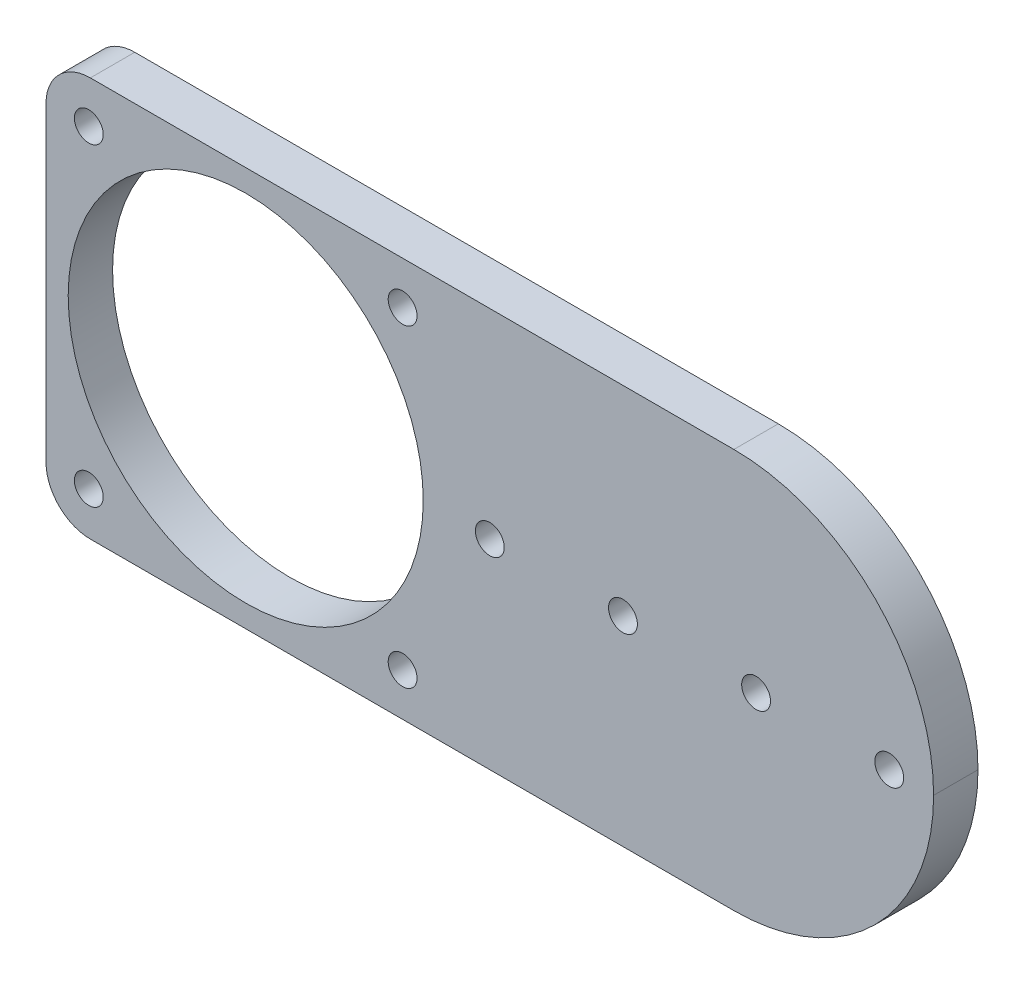
ISO-10303-21;
HEADER;
FILE_DESCRIPTION(('STEP AP214'),'2;1');
FILE_NAME('part.step','',(''),(''),'','','');
FILE_SCHEMA(('AUTOMOTIVE_DESIGN { 1 0 10303 214 1 1 1 1 }'));
ENDSEC;
DATA;
#1=APPLICATION_CONTEXT('core data for automotive mechanical design processes');
#2=APPLICATION_PROTOCOL_DEFINITION('international standard','automotive_design',2000,#1);
#3=PRODUCT_CONTEXT('',#1,'mechanical');
#4=PRODUCT('Part','Part','',(#3));
#5=PRODUCT_RELATED_PRODUCT_CATEGORY('part','',(#4));
#6=PRODUCT_DEFINITION_FORMATION('','',#4);
#7=PRODUCT_DEFINITION_CONTEXT('part definition',#1,'design');
#8=PRODUCT_DEFINITION('design','',#6,#7);
#9=PRODUCT_DEFINITION_SHAPE('','',#8);
#10=(LENGTH_UNIT() NAMED_UNIT(*) SI_UNIT(.MILLI.,.METRE.));
#11=(NAMED_UNIT(*) PLANE_ANGLE_UNIT() SI_UNIT($,.RADIAN.));
#12=(NAMED_UNIT(*) SI_UNIT($,.STERADIAN.) SOLID_ANGLE_UNIT());
#13=UNCERTAINTY_MEASURE_WITH_UNIT(LENGTH_MEASURE(1.E-05),#10,'distance_accuracy_value','');
#14=(GEOMETRIC_REPRESENTATION_CONTEXT(3) GLOBAL_UNCERTAINTY_ASSIGNED_CONTEXT((#13)) GLOBAL_UNIT_ASSIGNED_CONTEXT((#10,
#11,#12)) REPRESENTATION_CONTEXT('',''));
#15=CARTESIAN_POINT('',(0.,0.,0.));
#16=DIRECTION('',(0.,0.,1.));
#17=DIRECTION('',(1.,0.,0.));
#18=AXIS2_PLACEMENT_3D('',#15,#16,#17);
#19=CARTESIAN_POINT('',(0.,0.,10.));
#20=DIRECTION('',(0.,0.,1.));
#21=DIRECTION('',(1.,0.,0.));
#22=AXIS2_PLACEMENT_3D('',#19,#20,#21);
#23=PLANE('',#22);
#24=CARTESIAN_POINT('',(100.245231607629,0.,10.));
#25=DIRECTION('',(0.,0.,1.));
#26=DIRECTION('',(1.,0.,0.));
#27=AXIS2_PLACEMENT_3D('',#24,#25,#26);
#28=CIRCLE('',#27,3.25000000000001);
#29=CARTESIAN_POINT('',(103.495231607629,0.,10.));
#30=VERTEX_POINT('',#29);
#31=EDGE_CURVE('E487',#30,#30,#28,.T.);
#32=ORIENTED_EDGE('',*,*,#31,.F.);
#33=EDGE_LOOP('',(#32));
#34=FACE_BOUND('',#33,.T.);
#35=CARTESIAN_POINT('',(-50.1101074516982,-35.3553390593269,10.));
#36=DIRECTION('',(0.,0.,1.));
#37=DIRECTION('',(1.,0.,0.));
#38=AXIS2_PLACEMENT_3D('',#35,#36,#37);
#39=CIRCLE('',#38,3.24999999999999);
#40=CARTESIAN_POINT('',(-46.8601074516982,-35.3553390593269,10.));
#41=VERTEX_POINT('',#40);
#42=EDGE_CURVE('E468',#41,#41,#39,.T.);
#43=ORIENTED_EDGE('',*,*,#42,.F.);
#44=EDGE_LOOP('',(#43));
#45=FACE_BOUND('',#44,.T.);
#46=CARTESIAN_POINT('',(20.6005706669572,-35.3553390593269,10.));
#47=DIRECTION('',(0.,0.,1.));
#48=DIRECTION('',(1.,0.,0.));
#49=AXIS2_PLACEMENT_3D('',#46,#47,#48);
#50=CIRCLE('',#49,3.25);
#51=CARTESIAN_POINT('',(23.8505706669572,-35.3553390593269,10.));
#52=VERTEX_POINT('',#51);
#53=EDGE_CURVE('E235',#52,#52,#50,.T.);
#54=ORIENTED_EDGE('',*,*,#53,.F.);
#55=EDGE_LOOP('',(#54));
#56=FACE_BOUND('',#55,.T.);
#57=CARTESIAN_POINT('',(-14.7547683923706,0.,10.));
#58=DIRECTION('',(0.,0.,1.));
#59=DIRECTION('',(1.,0.,0.));
#60=AXIS2_PLACEMENT_3D('',#57,#58,#59);
#61=CIRCLE('',#60,40.);
#62=CARTESIAN_POINT('',(25.2452316076294,0.,10.));
#63=VERTEX_POINT('',#62);
#64=EDGE_CURVE('E216',#63,#63,#61,.T.);
#65=ORIENTED_EDGE('',*,*,#64,.F.);
#66=EDGE_LOOP('',(#65));
#67=FACE_BOUND('',#66,.T.);
#68=DIRECTION('',(0.,-1.,0.));
#69=VECTOR('',#68,1.);
#70=CARTESIAN_POINT('',(-59.7547683923706,45.,10.));
#71=LINE('',#70,#69);
#72=CARTESIAN_POINT('',(-59.7547683923706,35.,10.));
#73=VERTEX_POINT('',#72);
#74=CARTESIAN_POINT('',(-59.7547683923706,-35.,10.));
#75=VERTEX_POINT('',#74);
#76=EDGE_CURVE('E160',#73,#75,#71,.T.);
#77=ORIENTED_EDGE('',*,*,#76,.T.);
#78=CARTESIAN_POINT('',(-49.7547683923706,-35.,10.));
#79=DIRECTION('',(0.,0.,1.));
#80=DIRECTION('',(1.,0.,0.));
#81=AXIS2_PLACEMENT_3D('',#78,#79,#80);
#82=CIRCLE('',#81,10.);
#83=CARTESIAN_POINT('',(-49.7547683923706,-45.,10.));
#84=VERTEX_POINT('',#83);
#85=EDGE_CURVE('E54',#75,#84,#82,.T.);
#86=ORIENTED_EDGE('',*,*,#85,.T.);
#87=DIRECTION('',(1.,0.,0.));
#88=VECTOR('',#87,1.);
#89=CARTESIAN_POINT('',(-59.7547683923706,-45.,10.));
#90=LINE('',#89,#88);
#91=CARTESIAN_POINT('',(95.2452316076294,-45.,10.));
#92=VERTEX_POINT('',#91);
#93=EDGE_CURVE('E120',#84,#92,#90,.T.);
#94=ORIENTED_EDGE('',*,*,#93,.T.);
#95=CARTESIAN_POINT('',(95.2452316076294,0.,10.));
#96=DIRECTION('',(0.,0.,1.));
#97=DIRECTION('',(1.,0.,0.));
#98=AXIS2_PLACEMENT_3D('',#95,#96,#97);
#99=CIRCLE('',#98,45.);
#100=CARTESIAN_POINT('',(140.245231607629,0.,10.));
#101=VERTEX_POINT('',#100);
#102=EDGE_CURVE('E144',#92,#101,#99,.T.);
#103=ORIENTED_EDGE('',*,*,#102,.T.);
#104=CARTESIAN_POINT('',(95.2452316076294,0.,10.));
#105=DIRECTION('',(0.,0.,1.));
#106=DIRECTION('',(1.,0.,0.));
#107=AXIS2_PLACEMENT_3D('',#104,#105,#106);
#108=CIRCLE('',#107,45.);
#109=CARTESIAN_POINT('',(95.2452316076294,45.,10.));
#110=VERTEX_POINT('',#109);
#111=EDGE_CURVE('E126',#101,#110,#108,.T.);
#112=ORIENTED_EDGE('',*,*,#111,.T.);
#113=DIRECTION('',(-1.,0.,0.));
#114=VECTOR('',#113,1.);
#115=CARTESIAN_POINT('',(-59.7547683923706,45.,10.));
#116=LINE('',#115,#114);
#117=CARTESIAN_POINT('',(-49.7547683923706,45.,10.));
#118=VERTEX_POINT('',#117);
#119=EDGE_CURVE('E155',#110,#118,#116,.T.);
#120=ORIENTED_EDGE('',*,*,#119,.T.);
#121=CARTESIAN_POINT('',(-49.7547683923706,35.,10.));
#122=DIRECTION('',(0.,0.,1.));
#123=DIRECTION('',(1.,0.,0.));
#124=AXIS2_PLACEMENT_3D('',#121,#122,#123);
#125=CIRCLE('',#124,10.);
#126=EDGE_CURVE('E176',#118,#73,#125,.T.);
#127=ORIENTED_EDGE('',*,*,#126,.T.);
#128=EDGE_LOOP('',(#77,#86,#94,#103,#112,#120,#127));
#129=FACE_BOUND('',#128,.T.);
#130=CARTESIAN_POINT('',(-50.1101074516982,35.3553390593272,10.));
#131=DIRECTION('',(0.,0.,1.));
#132=DIRECTION('',(1.,0.,0.));
#133=AXIS2_PLACEMENT_3D('',#130,#131,#132);
#134=CIRCLE('',#133,3.25);
#135=CARTESIAN_POINT('',(-46.8601074516981,35.3553390593272,10.));
#136=VERTEX_POINT('',#135);
#137=EDGE_CURVE('E209',#136,#136,#134,.T.);
#138=ORIENTED_EDGE('',*,*,#137,.F.);
#139=EDGE_LOOP('',(#138));
#140=FACE_BOUND('',#139,.T.);
#141=CARTESIAN_POINT('',(20.6005706669572,35.3553390593272,10.));
#142=DIRECTION('',(0.,0.,1.));
#143=DIRECTION('',(1.,0.,0.));
#144=AXIS2_PLACEMENT_3D('',#141,#142,#143);
#145=CIRCLE('',#144,3.25);
#146=CARTESIAN_POINT('',(23.8505706669572,35.3553390593272,10.));
#147=VERTEX_POINT('',#146);
#148=EDGE_CURVE('E224',#147,#147,#145,.T.);
#149=ORIENTED_EDGE('',*,*,#148,.F.);
#150=EDGE_LOOP('',(#149));
#151=FACE_BOUND('',#150,.T.);
#152=CARTESIAN_POINT('',(40.2452316076294,0.,10.));
#153=DIRECTION('',(0.,0.,1.));
#154=DIRECTION('',(1.,0.,0.));
#155=AXIS2_PLACEMENT_3D('',#152,#153,#154);
#156=CIRCLE('',#155,3.25);
#157=CARTESIAN_POINT('',(43.4952316076294,0.,10.));
#158=VERTEX_POINT('',#157);
#159=EDGE_CURVE('E460',#158,#158,#156,.T.);
#160=ORIENTED_EDGE('',*,*,#159,.F.);
#161=EDGE_LOOP('',(#160));
#162=FACE_BOUND('',#161,.T.);
#163=CARTESIAN_POINT('',(70.2452316076294,0.,10.));
#164=DIRECTION('',(0.,0.,1.));
#165=DIRECTION('',(1.,0.,0.));
#166=AXIS2_PLACEMENT_3D('',#163,#164,#165);
#167=CIRCLE('',#166,3.25000000000001);
#168=CARTESIAN_POINT('',(73.4952316076294,0.,10.));
#169=VERTEX_POINT('',#168);
#170=EDGE_CURVE('E486',#169,#169,#167,.T.);
#171=ORIENTED_EDGE('',*,*,#170,.F.);
#172=EDGE_LOOP('',(#171));
#173=FACE_BOUND('',#172,.T.);
#174=CARTESIAN_POINT('',(130.245231607629,0.,10.));
#175=DIRECTION('',(0.,0.,1.));
#176=DIRECTION('',(1.,0.,0.));
#177=AXIS2_PLACEMENT_3D('',#174,#175,#176);
#178=CIRCLE('',#177,3.25000000000001);
#179=CARTESIAN_POINT('',(133.495231607629,0.,10.));
#180=VERTEX_POINT('',#179);
#181=EDGE_CURVE('E495',#180,#180,#178,.T.);
#182=ORIENTED_EDGE('',*,*,#181,.F.);
#183=EDGE_LOOP('',(#182));
#184=FACE_BOUND('',#183,.T.);
#185=ADVANCED_FACE('F45',(#34,#45,#56,#67,#129,#140,#151,#162,#173,#184),#23,.T.);
#186=CARTESIAN_POINT('',(0.,0.,0.));
#187=DIRECTION('',(0.,0.,1.));
#188=DIRECTION('',(1.,0.,0.));
#189=AXIS2_PLACEMENT_3D('',#186,#187,#188);
#190=PLANE('',#189);
#191=DIRECTION('',(1.,0.,0.));
#192=VECTOR('',#191,1.);
#193=CARTESIAN_POINT('',(-59.7547683923706,-45.,0.));
#194=LINE('',#193,#192);
#195=CARTESIAN_POINT('',(-49.7547683923706,-45.,0.));
#196=VERTEX_POINT('',#195);
#197=CARTESIAN_POINT('',(95.2452316076294,-45.,0.));
#198=VERTEX_POINT('',#197);
#199=EDGE_CURVE('E161',#196,#198,#194,.T.);
#200=ORIENTED_EDGE('',*,*,#199,.F.);
#201=CARTESIAN_POINT('',(-49.7547683923706,-35.,0.));
#202=DIRECTION('',(0.,0.,1.));
#203=DIRECTION('',(1.,0.,0.));
#204=AXIS2_PLACEMENT_3D('',#201,#202,#203);
#205=CIRCLE('',#204,10.);
#206=CARTESIAN_POINT('',(-59.7547683923706,-35.,0.));
#207=VERTEX_POINT('',#206);
#208=EDGE_CURVE('E186',#196,#207,#205,.F.);
#209=ORIENTED_EDGE('',*,*,#208,.T.);
#210=DIRECTION('',(0.,-1.,0.));
#211=VECTOR('',#210,1.);
#212=CARTESIAN_POINT('',(-59.7547683923706,45.,0.));
#213=LINE('',#212,#211);
#214=CARTESIAN_POINT('',(-59.7547683923706,35.,0.));
#215=VERTEX_POINT('',#214);
#216=EDGE_CURVE('E205',#215,#207,#213,.T.);
#217=ORIENTED_EDGE('',*,*,#216,.F.);
#218=CARTESIAN_POINT('',(-49.7547683923706,35.,0.));
#219=DIRECTION('',(0.,0.,1.));
#220=DIRECTION('',(1.,0.,0.));
#221=AXIS2_PLACEMENT_3D('',#218,#219,#220);
#222=CIRCLE('',#221,10.);
#223=CARTESIAN_POINT('',(-49.7547683923706,45.,0.));
#224=VERTEX_POINT('',#223);
#225=EDGE_CURVE('E189',#215,#224,#222,.F.);
#226=ORIENTED_EDGE('',*,*,#225,.T.);
#227=DIRECTION('',(-1.,0.,0.));
#228=VECTOR('',#227,1.);
#229=CARTESIAN_POINT('',(-59.7547683923706,45.,0.));
#230=LINE('',#229,#228);
#231=CARTESIAN_POINT('',(95.2452316076294,45.,0.));
#232=VERTEX_POINT('',#231);
#233=EDGE_CURVE('E116',#232,#224,#230,.T.);
#234=ORIENTED_EDGE('',*,*,#233,.F.);
#235=CARTESIAN_POINT('',(95.2452316076294,0.,0.));
#236=DIRECTION('',(0.,0.,1.));
#237=DIRECTION('',(1.,0.,0.));
#238=AXIS2_PLACEMENT_3D('',#235,#236,#237);
#239=CIRCLE('',#238,45.);
#240=CARTESIAN_POINT('',(140.245231607629,0.,0.));
#241=VERTEX_POINT('',#240);
#242=EDGE_CURVE('E108',#232,#241,#239,.F.);
#243=ORIENTED_EDGE('',*,*,#242,.T.);
#244=CARTESIAN_POINT('',(95.2452316076294,0.,0.));
#245=DIRECTION('',(0.,0.,1.));
#246=DIRECTION('',(1.,0.,0.));
#247=AXIS2_PLACEMENT_3D('',#244,#245,#246);
#248=CIRCLE('',#247,45.);
#249=EDGE_CURVE('E114',#241,#198,#248,.F.);
#250=ORIENTED_EDGE('',*,*,#249,.T.);
#251=EDGE_LOOP('',(#200,#209,#217,#226,#234,#243,#250));
#252=FACE_BOUND('',#251,.T.);
#253=CARTESIAN_POINT('',(-50.1101074516982,35.3553390593272,0.));
#254=DIRECTION('',(0.,0.,1.));
#255=DIRECTION('',(1.,0.,0.));
#256=AXIS2_PLACEMENT_3D('',#253,#254,#255);
#257=CIRCLE('',#256,3.25);
#258=CARTESIAN_POINT('',(-46.8601074516981,35.3553390593272,0.));
#259=VERTEX_POINT('',#258);
#260=EDGE_CURVE('E162',#259,#259,#257,.T.);
#261=ORIENTED_EDGE('',*,*,#260,.T.);
#262=EDGE_LOOP('',(#261));
#263=FACE_BOUND('',#262,.T.);
#264=CARTESIAN_POINT('',(-14.7547683923706,0.,0.));
#265=DIRECTION('',(0.,0.,1.));
#266=DIRECTION('',(1.,0.,0.));
#267=AXIS2_PLACEMENT_3D('',#264,#265,#266);
#268=CIRCLE('',#267,40.);
#269=CARTESIAN_POINT('',(25.2452316076294,0.,0.));
#270=VERTEX_POINT('',#269);
#271=EDGE_CURVE('E219',#270,#270,#268,.T.);
#272=ORIENTED_EDGE('',*,*,#271,.T.);
#273=EDGE_LOOP('',(#272));
#274=FACE_BOUND('',#273,.T.);
#275=CARTESIAN_POINT('',(20.6005706669572,35.3553390593272,0.));
#276=DIRECTION('',(0.,0.,1.));
#277=DIRECTION('',(1.,0.,0.));
#278=AXIS2_PLACEMENT_3D('',#275,#276,#277);
#279=CIRCLE('',#278,3.25);
#280=CARTESIAN_POINT('',(23.8505706669572,35.3553390593272,0.));
#281=VERTEX_POINT('',#280);
#282=EDGE_CURVE('E230',#281,#281,#279,.T.);
#283=ORIENTED_EDGE('',*,*,#282,.T.);
#284=EDGE_LOOP('',(#283));
#285=FACE_BOUND('',#284,.T.);
#286=CARTESIAN_POINT('',(20.6005706669572,-35.3553390593269,0.));
#287=DIRECTION('',(0.,0.,1.));
#288=DIRECTION('',(1.,0.,0.));
#289=AXIS2_PLACEMENT_3D('',#286,#287,#288);
#290=CIRCLE('',#289,3.25);
#291=CARTESIAN_POINT('',(23.8505706669572,-35.3553390593269,0.));
#292=VERTEX_POINT('',#291);
#293=EDGE_CURVE('E231',#292,#292,#290,.T.);
#294=ORIENTED_EDGE('',*,*,#293,.T.);
#295=EDGE_LOOP('',(#294));
#296=FACE_BOUND('',#295,.T.);
#297=CARTESIAN_POINT('',(40.2452316076294,0.,0.));
#298=DIRECTION('',(0.,0.,1.));
#299=DIRECTION('',(1.,0.,0.));
#300=AXIS2_PLACEMENT_3D('',#297,#298,#299);
#301=CIRCLE('',#300,3.25);
#302=CARTESIAN_POINT('',(43.4952316076294,0.,0.));
#303=VERTEX_POINT('',#302);
#304=EDGE_CURVE('E464',#303,#303,#301,.T.);
#305=ORIENTED_EDGE('',*,*,#304,.T.);
#306=EDGE_LOOP('',(#305));
#307=FACE_BOUND('',#306,.T.);
#308=CARTESIAN_POINT('',(-50.1101074516982,-35.3553390593269,0.));
#309=DIRECTION('',(0.,0.,1.));
#310=DIRECTION('',(1.,0.,0.));
#311=AXIS2_PLACEMENT_3D('',#308,#309,#310);
#312=CIRCLE('',#311,3.24999999999999);
#313=CARTESIAN_POINT('',(-46.8601074516982,-35.3553390593269,0.));
#314=VERTEX_POINT('',#313);
#315=EDGE_CURVE('E472',#314,#314,#312,.T.);
#316=ORIENTED_EDGE('',*,*,#315,.T.);
#317=EDGE_LOOP('',(#316));
#318=FACE_BOUND('',#317,.T.);
#319=CARTESIAN_POINT('',(70.2452316076294,0.,0.));
#320=DIRECTION('',(0.,0.,1.));
#321=DIRECTION('',(1.,0.,0.));
#322=AXIS2_PLACEMENT_3D('',#319,#320,#321);
#323=CIRCLE('',#322,3.25000000000001);
#324=CARTESIAN_POINT('',(73.4952316076294,0.,0.));
#325=VERTEX_POINT('',#324);
#326=EDGE_CURVE('E482',#325,#325,#323,.T.);
#327=ORIENTED_EDGE('',*,*,#326,.T.);
#328=EDGE_LOOP('',(#327));
#329=FACE_BOUND('',#328,.T.);
#330=CARTESIAN_POINT('',(100.245231607629,0.,0.));
#331=DIRECTION('',(0.,0.,1.));
#332=DIRECTION('',(1.,0.,0.));
#333=AXIS2_PLACEMENT_3D('',#330,#331,#332);
#334=CIRCLE('',#333,3.25000000000001);
#335=CARTESIAN_POINT('',(103.495231607629,0.,0.));
#336=VERTEX_POINT('',#335);
#337=EDGE_CURVE('E492',#336,#336,#334,.T.);
#338=ORIENTED_EDGE('',*,*,#337,.T.);
#339=EDGE_LOOP('',(#338));
#340=FACE_BOUND('',#339,.T.);
#341=CARTESIAN_POINT('',(130.245231607629,0.,0.));
#342=DIRECTION('',(0.,0.,1.));
#343=DIRECTION('',(1.,0.,0.));
#344=AXIS2_PLACEMENT_3D('',#341,#342,#343);
#345=CIRCLE('',#344,3.25000000000001);
#346=CARTESIAN_POINT('',(133.495231607629,0.,0.));
#347=VERTEX_POINT('',#346);
#348=EDGE_CURVE('E130',#347,#347,#345,.T.);
#349=ORIENTED_EDGE('',*,*,#348,.T.);
#350=EDGE_LOOP('',(#349));
#351=FACE_BOUND('',#350,.T.);
#352=ADVANCED_FACE('F111',(#252,#263,#274,#285,#296,#307,#318,#329,#340,#351),#190,.F.);
#353=CARTESIAN_POINT('',(-59.7547683923706,45.,10.));
#354=DIRECTION('',(0.,-1.,0.));
#355=DIRECTION('',(0.,0.,-1.));
#356=AXIS2_PLACEMENT_3D('',#353,#354,#355);
#357=PLANE('',#356);
#358=ORIENTED_EDGE('',*,*,#233,.T.);
#359=DIRECTION('',(0.,0.,-1.));
#360=VECTOR('',#359,1.);
#361=CARTESIAN_POINT('',(-49.7547683923706,45.,10.));
#362=LINE('',#361,#360);
#363=EDGE_CURVE('E12',#224,#118,#362,.F.);
#364=ORIENTED_EDGE('',*,*,#363,.T.);
#365=ORIENTED_EDGE('',*,*,#119,.F.);
#366=DIRECTION('',(0.,0.,-1.));
#367=VECTOR('',#366,1.);
#368=CARTESIAN_POINT('',(95.2452316076294,45.,10.));
#369=LINE('',#368,#367);
#370=EDGE_CURVE('E195',#110,#232,#369,.T.);
#371=ORIENTED_EDGE('',*,*,#370,.T.);
#372=EDGE_LOOP('',(#358,#364,#365,#371));
#373=FACE_BOUND('',#372,.T.);
#374=ADVANCED_FACE('F266',(#373),#357,.F.);
#375=CARTESIAN_POINT('',(-59.7547683923706,45.,10.));
#376=DIRECTION('',(1.,0.,0.));
#377=DIRECTION('',(0.,0.,-1.));
#378=AXIS2_PLACEMENT_3D('',#375,#376,#377);
#379=PLANE('',#378);
#380=ORIENTED_EDGE('',*,*,#216,.T.);
#381=DIRECTION('',(0.,0.,-1.));
#382=VECTOR('',#381,1.);
#383=CARTESIAN_POINT('',(-59.7547683923706,-35.,10.));
#384=LINE('',#383,#382);
#385=EDGE_CURVE('E67',#207,#75,#384,.F.);
#386=ORIENTED_EDGE('',*,*,#385,.T.);
#387=ORIENTED_EDGE('',*,*,#76,.F.);
#388=DIRECTION('',(0.,0.,-1.));
#389=VECTOR('',#388,1.);
#390=CARTESIAN_POINT('',(-59.7547683923706,35.,10.));
#391=LINE('',#390,#389);
#392=EDGE_CURVE('E182',#73,#215,#391,.T.);
#393=ORIENTED_EDGE('',*,*,#392,.T.);
#394=EDGE_LOOP('',(#380,#386,#387,#393));
#395=FACE_BOUND('',#394,.T.);
#396=ADVANCED_FACE('F273',(#395),#379,.F.);
#397=CARTESIAN_POINT('',(-59.7547683923706,-45.,10.));
#398=DIRECTION('',(0.,1.,0.));
#399=DIRECTION('',(0.,0.,1.));
#400=AXIS2_PLACEMENT_3D('',#397,#398,#399);
#401=PLANE('',#400);
#402=ORIENTED_EDGE('',*,*,#93,.F.);
#403=DIRECTION('',(0.,0.,-1.));
#404=VECTOR('',#403,1.);
#405=CARTESIAN_POINT('',(-49.7547683923706,-45.,10.));
#406=LINE('',#405,#404);
#407=EDGE_CURVE('E192',#84,#196,#406,.T.);
#408=ORIENTED_EDGE('',*,*,#407,.T.);
#409=ORIENTED_EDGE('',*,*,#199,.T.);
#410=DIRECTION('',(0.,0.,-1.));
#411=VECTOR('',#410,1.);
#412=CARTESIAN_POINT('',(95.2452316076294,-45.,10.));
#413=LINE('',#412,#411);
#414=EDGE_CURVE('E134',#198,#92,#413,.F.);
#415=ORIENTED_EDGE('',*,*,#414,.T.);
#416=EDGE_LOOP('',(#402,#408,#409,#415));
#417=FACE_BOUND('',#416,.T.);
#418=ADVANCED_FACE('F202',(#417),#401,.F.);
#419=CARTESIAN_POINT('',(-50.1101074516982,35.3553390593272,10.));
#420=DIRECTION('',(0.,0.,-1.));
#421=DIRECTION('',(-1.,0.,0.));
#422=AXIS2_PLACEMENT_3D('',#419,#420,#421);
#423=CYLINDRICAL_SURFACE('',#422,3.25);
#424=ORIENTED_EDGE('',*,*,#137,.T.);
#425=EDGE_LOOP('',(#424));
#426=FACE_BOUND('',#425,.T.);
#427=ORIENTED_EDGE('',*,*,#260,.F.);
#428=EDGE_LOOP('',(#427));
#429=FACE_BOUND('',#428,.T.);
#430=ADVANCED_FACE('F250',(#426,#429),#423,.F.);
#431=CARTESIAN_POINT('',(-14.7547683923706,0.,10.));
#432=DIRECTION('',(0.,0.,-1.));
#433=DIRECTION('',(-1.,0.,0.));
#434=AXIS2_PLACEMENT_3D('',#431,#432,#433);
#435=CYLINDRICAL_SURFACE('',#434,40.);
#436=ORIENTED_EDGE('',*,*,#64,.T.);
#437=EDGE_LOOP('',(#436));
#438=FACE_BOUND('',#437,.T.);
#439=ORIENTED_EDGE('',*,*,#271,.F.);
#440=EDGE_LOOP('',(#439));
#441=FACE_BOUND('',#440,.T.);
#442=ADVANCED_FACE('F247',(#438,#441),#435,.F.);
#443=CARTESIAN_POINT('',(20.6005706669572,35.3553390593272,10.));
#444=DIRECTION('',(0.,0.,-1.));
#445=DIRECTION('',(-1.,0.,0.));
#446=AXIS2_PLACEMENT_3D('',#443,#444,#445);
#447=CYLINDRICAL_SURFACE('',#446,3.25);
#448=ORIENTED_EDGE('',*,*,#148,.T.);
#449=EDGE_LOOP('',(#448));
#450=FACE_BOUND('',#449,.T.);
#451=ORIENTED_EDGE('',*,*,#282,.F.);
#452=EDGE_LOOP('',(#451));
#453=FACE_BOUND('',#452,.T.);
#454=ADVANCED_FACE('F249',(#450,#453),#447,.F.);
#455=CARTESIAN_POINT('',(20.6005706669572,-35.3553390593269,10.));
#456=DIRECTION('',(0.,0.,-1.));
#457=DIRECTION('',(-1.,0.,0.));
#458=AXIS2_PLACEMENT_3D('',#455,#456,#457);
#459=CYLINDRICAL_SURFACE('',#458,3.25);
#460=ORIENTED_EDGE('',*,*,#53,.T.);
#461=EDGE_LOOP('',(#460));
#462=FACE_BOUND('',#461,.T.);
#463=ORIENTED_EDGE('',*,*,#293,.F.);
#464=EDGE_LOOP('',(#463));
#465=FACE_BOUND('',#464,.T.);
#466=ADVANCED_FACE('F256',(#462,#465),#459,.F.);
#467=CARTESIAN_POINT('',(40.2452316076294,0.,10.));
#468=DIRECTION('',(0.,0.,-1.));
#469=DIRECTION('',(-1.,0.,0.));
#470=AXIS2_PLACEMENT_3D('',#467,#468,#469);
#471=CYLINDRICAL_SURFACE('',#470,3.25);
#472=ORIENTED_EDGE('',*,*,#159,.T.);
#473=EDGE_LOOP('',(#472));
#474=FACE_BOUND('',#473,.T.);
#475=ORIENTED_EDGE('',*,*,#304,.F.);
#476=EDGE_LOOP('',(#475));
#477=FACE_BOUND('',#476,.T.);
#478=ADVANCED_FACE('F391',(#474,#477),#471,.F.);
#479=CARTESIAN_POINT('',(-50.1101074516982,-35.3553390593269,10.));
#480=DIRECTION('',(0.,0.,-1.));
#481=DIRECTION('',(-1.,0.,0.));
#482=AXIS2_PLACEMENT_3D('',#479,#480,#481);
#483=CYLINDRICAL_SURFACE('',#482,3.24999999999999);
#484=ORIENTED_EDGE('',*,*,#42,.T.);
#485=EDGE_LOOP('',(#484));
#486=FACE_BOUND('',#485,.T.);
#487=ORIENTED_EDGE('',*,*,#315,.F.);
#488=EDGE_LOOP('',(#487));
#489=FACE_BOUND('',#488,.T.);
#490=ADVANCED_FACE('F380',(#486,#489),#483,.F.);
#491=CARTESIAN_POINT('',(70.2452316076294,0.,10.));
#492=DIRECTION('',(0.,0.,-1.));
#493=DIRECTION('',(-1.,0.,0.));
#494=AXIS2_PLACEMENT_3D('',#491,#492,#493);
#495=CYLINDRICAL_SURFACE('',#494,3.25000000000001);
#496=ORIENTED_EDGE('',*,*,#170,.T.);
#497=EDGE_LOOP('',(#496));
#498=FACE_BOUND('',#497,.T.);
#499=ORIENTED_EDGE('',*,*,#326,.F.);
#500=EDGE_LOOP('',(#499));
#501=FACE_BOUND('',#500,.T.);
#502=ADVANCED_FACE('F369',(#498,#501),#495,.F.);
#503=CARTESIAN_POINT('',(100.245231607629,0.,10.));
#504=DIRECTION('',(0.,0.,-1.));
#505=DIRECTION('',(-1.,0.,0.));
#506=AXIS2_PLACEMENT_3D('',#503,#504,#505);
#507=CYLINDRICAL_SURFACE('',#506,3.25000000000001);
#508=ORIENTED_EDGE('',*,*,#31,.T.);
#509=EDGE_LOOP('',(#508));
#510=FACE_BOUND('',#509,.T.);
#511=ORIENTED_EDGE('',*,*,#337,.F.);
#512=EDGE_LOOP('',(#511));
#513=FACE_BOUND('',#512,.T.);
#514=ADVANCED_FACE('F358',(#510,#513),#507,.F.);
#515=CARTESIAN_POINT('',(130.245231607629,0.,10.));
#516=DIRECTION('',(0.,0.,-1.));
#517=DIRECTION('',(-1.,0.,0.));
#518=AXIS2_PLACEMENT_3D('',#515,#516,#517);
#519=CYLINDRICAL_SURFACE('',#518,3.25000000000001);
#520=ORIENTED_EDGE('',*,*,#181,.T.);
#521=EDGE_LOOP('',(#520));
#522=FACE_BOUND('',#521,.T.);
#523=ORIENTED_EDGE('',*,*,#348,.F.);
#524=EDGE_LOOP('',(#523));
#525=FACE_BOUND('',#524,.T.);
#526=ADVANCED_FACE('F282',(#522,#525),#519,.F.);
#527=CARTESIAN_POINT('',(95.2452316076294,0.,10.));
#528=DIRECTION('',(0.,0.,-1.));
#529=DIRECTION('',(-1.,0.,0.));
#530=AXIS2_PLACEMENT_3D('',#527,#528,#529);
#531=CYLINDRICAL_SURFACE('',#530,45.);
#532=ORIENTED_EDGE('',*,*,#370,.F.);
#533=ORIENTED_EDGE('',*,*,#111,.F.);
#534=DIRECTION('',(0.,0.,-1.));
#535=VECTOR('',#534,1.);
#536=CARTESIAN_POINT('',(140.245231607629,0.,10.));
#537=LINE('',#536,#535);
#538=EDGE_CURVE('E124',#241,#101,#537,.F.);
#539=ORIENTED_EDGE('',*,*,#538,.F.);
#540=ORIENTED_EDGE('',*,*,#242,.F.);
#541=EDGE_LOOP('',(#532,#533,#539,#540));
#542=FACE_BOUND('',#541,.T.);
#543=ADVANCED_FACE('F125',(#542),#531,.T.);
#544=CARTESIAN_POINT('',(95.2452316076294,0.,10.));
#545=DIRECTION('',(0.,0.,-1.));
#546=DIRECTION('',(-1.,0.,0.));
#547=AXIS2_PLACEMENT_3D('',#544,#545,#546);
#548=CYLINDRICAL_SURFACE('',#547,45.);
#549=ORIENTED_EDGE('',*,*,#102,.F.);
#550=ORIENTED_EDGE('',*,*,#414,.F.);
#551=ORIENTED_EDGE('',*,*,#249,.F.);
#552=ORIENTED_EDGE('',*,*,#538,.T.);
#553=EDGE_LOOP('',(#549,#550,#551,#552));
#554=FACE_BOUND('',#553,.T.);
#555=ADVANCED_FACE('F132',(#554),#548,.T.);
#556=CARTESIAN_POINT('',(-49.7547683923706,-35.,10.));
#557=DIRECTION('',(0.,0.,-1.));
#558=DIRECTION('',(-1.,0.,0.));
#559=AXIS2_PLACEMENT_3D('',#556,#557,#558);
#560=CYLINDRICAL_SURFACE('',#559,10.);
#561=ORIENTED_EDGE('',*,*,#85,.F.);
#562=ORIENTED_EDGE('',*,*,#385,.F.);
#563=ORIENTED_EDGE('',*,*,#208,.F.);
#564=ORIENTED_EDGE('',*,*,#407,.F.);
#565=EDGE_LOOP('',(#561,#562,#563,#564));
#566=FACE_BOUND('',#565,.T.);
#567=ADVANCED_FACE('F280',(#566),#560,.T.);
#568=CARTESIAN_POINT('',(-49.7547683923706,35.,10.));
#569=DIRECTION('',(0.,0.,-1.));
#570=DIRECTION('',(-1.,0.,0.));
#571=AXIS2_PLACEMENT_3D('',#568,#569,#570);
#572=CYLINDRICAL_SURFACE('',#571,10.);
#573=ORIENTED_EDGE('',*,*,#126,.F.);
#574=ORIENTED_EDGE('',*,*,#363,.F.);
#575=ORIENTED_EDGE('',*,*,#225,.F.);
#576=ORIENTED_EDGE('',*,*,#392,.F.);
#577=EDGE_LOOP('',(#573,#574,#575,#576));
#578=FACE_BOUND('',#577,.T.);
#579=ADVANCED_FACE('F47',(#578),#572,.T.);
#580=CLOSED_SHELL('',(#185,#352,#374,#396,#418,#430,#442,#454,#466,#478,#490,#502,#514,#526,
#543,#555,#567,#579));
#581=MANIFOLD_SOLID_BREP('B2',#580);
#582=ADVANCED_BREP_SHAPE_REPRESENTATION('',(#18,#581),#14);
#583=SHAPE_DEFINITION_REPRESENTATION(#9,#582);
ENDSEC;
END-ISO-10303-21;
